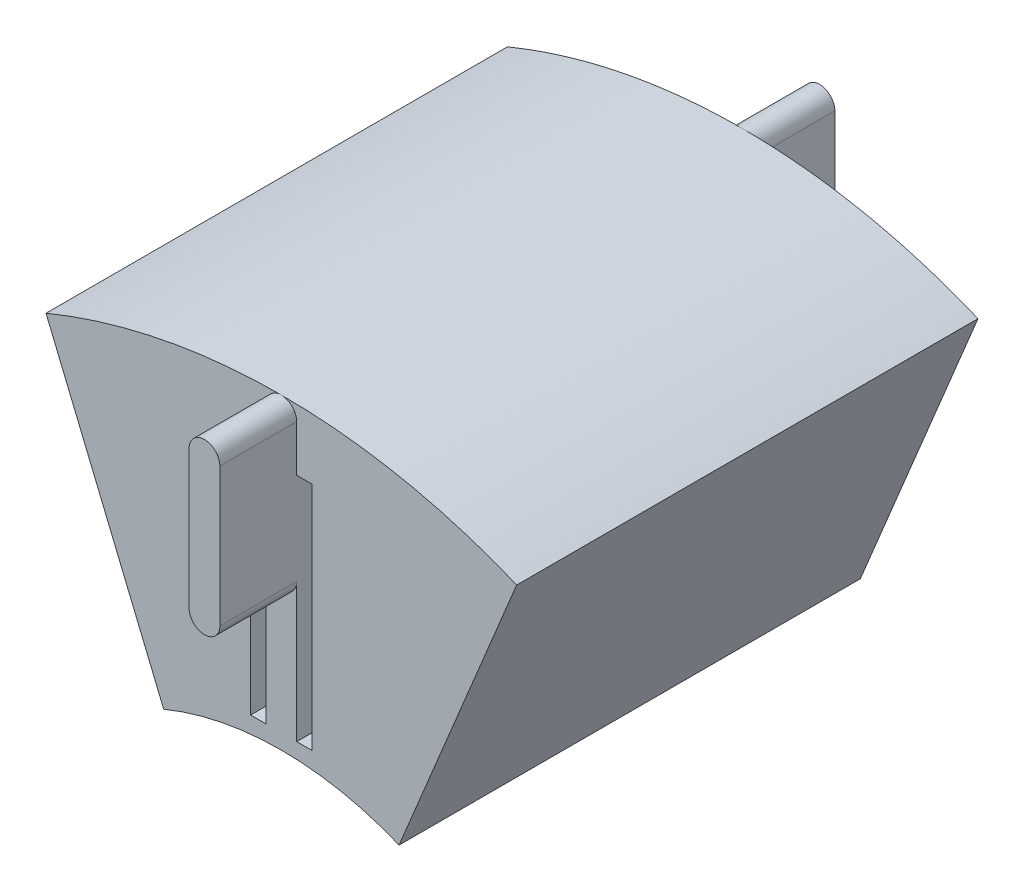
ISO-10303-21;
HEADER;
FILE_DESCRIPTION(('STEP AP214'),'2;1');
FILE_NAME('part.step','',(''),(''),'','','');
FILE_SCHEMA(('AUTOMOTIVE_DESIGN { 1 0 10303 214 1 1 1 1 }'));
ENDSEC;
DATA;
#1=APPLICATION_CONTEXT('core data for automotive mechanical design processes');
#2=APPLICATION_PROTOCOL_DEFINITION('international standard','automotive_design',2000,#1);
#3=PRODUCT_CONTEXT('',#1,'mechanical');
#4=PRODUCT('Part','Part','',(#3));
#5=PRODUCT_RELATED_PRODUCT_CATEGORY('part','',(#4));
#6=PRODUCT_DEFINITION_FORMATION('','',#4);
#7=PRODUCT_DEFINITION_CONTEXT('part definition',#1,'design');
#8=PRODUCT_DEFINITION('design','',#6,#7);
#9=PRODUCT_DEFINITION_SHAPE('','',#8);
#10=(LENGTH_UNIT() NAMED_UNIT(*) SI_UNIT(.MILLI.,.METRE.));
#11=(NAMED_UNIT(*) PLANE_ANGLE_UNIT() SI_UNIT($,.RADIAN.));
#12=(NAMED_UNIT(*) SI_UNIT($,.STERADIAN.) SOLID_ANGLE_UNIT());
#13=UNCERTAINTY_MEASURE_WITH_UNIT(LENGTH_MEASURE(1.E-05),#10,'distance_accuracy_value','');
#14=(GEOMETRIC_REPRESENTATION_CONTEXT(3) GLOBAL_UNCERTAINTY_ASSIGNED_CONTEXT((#13)) GLOBAL_UNIT_ASSIGNED_CONTEXT((#10,
#11,#12)) REPRESENTATION_CONTEXT('',''));
#15=CARTESIAN_POINT('',(0.,0.,0.));
#16=DIRECTION('',(0.,0.,1.));
#17=DIRECTION('',(1.,0.,0.));
#18=AXIS2_PLACEMENT_3D('',#15,#16,#17);
#19=CARTESIAN_POINT('',(0.2,3.59775906502258,3.));
#20=DIRECTION('',(0.,-0.8,0.6));
#21=DIRECTION('',(0.,-0.6,-0.8));
#22=AXIS2_PLACEMENT_3D('',#19,#20,#21);
#23=PLANE('',#22);
#24=DIRECTION('',(0.,-0.6,-0.8));
#25=VECTOR('',#24,1.);
#26=CARTESIAN_POINT('',(-0.1,3.59775906502258,3.));
#27=LINE('',#26,#25);
#28=CARTESIAN_POINT('',(-0.1,3.59775906502258,3.));
#29=VERTEX_POINT('',#28);
#30=CARTESIAN_POINT('',(-0.0999999999999998,2.09775906502258,1.));
#31=VERTEX_POINT('',#30);
#32=EDGE_CURVE('E409',#29,#31,#27,.T.);
#33=ORIENTED_EDGE('',*,*,#32,.F.);
#34=DIRECTION('',(-1.,0.,0.));
#35=VECTOR('',#34,1.);
#36=CARTESIAN_POINT('',(0.2,3.59775906502258,3.));
#37=LINE('',#36,#35);
#38=CARTESIAN_POINT('',(-0.2,3.59775906502258,3.));
#39=VERTEX_POINT('',#38);
#40=EDGE_CURVE('E197',#29,#39,#37,.T.);
#41=ORIENTED_EDGE('',*,*,#40,.T.);
#42=DIRECTION('',(0.,0.6,0.8));
#43=VECTOR('',#42,1.);
#44=CARTESIAN_POINT('',(-0.2,3.59775906502258,3.));
#45=LINE('',#44,#43);
#46=CARTESIAN_POINT('',(-0.2,2.09775906502258,1.));
#47=VERTEX_POINT('',#46);
#48=EDGE_CURVE('E412',#47,#39,#45,.T.);
#49=ORIENTED_EDGE('',*,*,#48,.F.);
#50=DIRECTION('',(-1.,0.,0.));
#51=VECTOR('',#50,1.);
#52=CARTESIAN_POINT('',(0.2,2.09775906502258,1.));
#53=LINE('',#52,#51);
#54=EDGE_CURVE('E433',#31,#47,#53,.T.);
#55=ORIENTED_EDGE('',*,*,#54,.F.);
#56=EDGE_LOOP('',(#33,#41,#49,#55));
#57=FACE_BOUND('',#56,.T.);
#58=ADVANCED_FACE('F41',(#57),#23,.T.);
#59=CARTESIAN_POINT('',(0.2,2.09775906502258,3.));
#60=DIRECTION('',(0.,1.,0.));
#61=DIRECTION('',(0.,0.,1.));
#62=AXIS2_PLACEMENT_3D('',#59,#60,#61);
#63=PLANE('',#62);
#64=DIRECTION('',(0.,0.,1.));
#65=VECTOR('',#64,1.);
#66=CARTESIAN_POINT('',(-0.0999999999999999,2.09775906502258,3.));
#67=LINE('',#66,#65);
#68=CARTESIAN_POINT('',(-0.1,2.09775906502258,3.));
#69=VERTEX_POINT('',#68);
#70=EDGE_CURVE('E11',#31,#69,#67,.T.);
#71=ORIENTED_EDGE('',*,*,#70,.F.);
#72=ORIENTED_EDGE('',*,*,#54,.T.);
#73=DIRECTION('',(0.,0.,-1.));
#74=VECTOR('',#73,1.);
#75=CARTESIAN_POINT('',(-0.2,2.09775906502258,3.));
#76=LINE('',#75,#74);
#77=CARTESIAN_POINT('',(-0.2,2.09775906502258,3.));
#78=VERTEX_POINT('',#77);
#79=EDGE_CURVE('E423',#78,#47,#76,.T.);
#80=ORIENTED_EDGE('',*,*,#79,.F.);
#81=DIRECTION('',(-1.,0.,0.));
#82=VECTOR('',#81,1.);
#83=CARTESIAN_POINT('',(0.2,2.09775906502258,3.));
#84=LINE('',#83,#82);
#85=EDGE_CURVE('E198',#69,#78,#84,.T.);
#86=ORIENTED_EDGE('',*,*,#85,.F.);
#87=EDGE_LOOP('',(#71,#72,#80,#86));
#88=FACE_BOUND('',#87,.T.);
#89=ADVANCED_FACE('F389',(#88),#63,.T.);
#90=CARTESIAN_POINT('',(0.,0.,3.));
#91=DIRECTION('',(0.,0.,1.));
#92=DIRECTION('',(1.,0.,0.));
#93=AXIS2_PLACEMENT_3D('',#90,#91,#92);
#94=PLANE('',#93);
#95=DIRECTION('',(0.,1.,0.));
#96=VECTOR('',#95,1.);
#97=CARTESIAN_POINT('',(0.1,3.,3.));
#98=LINE('',#97,#96);
#99=CARTESIAN_POINT('',(0.1,3.59775906502258,3.));
#100=VERTEX_POINT('',#99);
#101=CARTESIAN_POINT('',(0.1,3.9,3.));
#102=VERTEX_POINT('',#101);
#103=EDGE_CURVE('E269',#100,#102,#98,.T.);
#104=ORIENTED_EDGE('',*,*,#103,.F.);
#105=CARTESIAN_POINT('',(0.2,3.59775906502258,3.));
#106=VERTEX_POINT('',#105);
#107=EDGE_CURVE('E202',#106,#100,#37,.T.);
#108=ORIENTED_EDGE('',*,*,#107,.F.);
#109=DIRECTION('',(0.,-1.,0.));
#110=VECTOR('',#109,1.);
#111=CARTESIAN_POINT('',(0.2,3.59775906502258,3.));
#112=LINE('',#111,#110);
#113=CARTESIAN_POINT('',(0.2,2.09775906502258,3.));
#114=VERTEX_POINT('',#113);
#115=EDGE_CURVE('E195',#106,#114,#112,.T.);
#116=ORIENTED_EDGE('',*,*,#115,.T.);
#117=CARTESIAN_POINT('',(0.1,2.09775906502258,3.));
#118=VERTEX_POINT('',#117);
#119=EDGE_CURVE('E185',#114,#118,#84,.T.);
#120=ORIENTED_EDGE('',*,*,#119,.T.);
#121=DIRECTION('',(0.,1.,0.));
#122=VECTOR('',#121,1.);
#123=CARTESIAN_POINT('',(0.1,3.59775906502258,3.));
#124=LINE('',#123,#122);
#125=CARTESIAN_POINT('',(0.1,3.,3.));
#126=VERTEX_POINT('',#125);
#127=EDGE_CURVE('E171',#118,#126,#124,.T.);
#128=ORIENTED_EDGE('',*,*,#127,.T.);
#129=CARTESIAN_POINT('',(0.,3.,3.));
#130=DIRECTION('',(0.,0.,1.));
#131=DIRECTION('',(1.,0.,0.));
#132=AXIS2_PLACEMENT_3D('',#129,#130,#131);
#133=CIRCLE('',#132,0.1);
#134=CARTESIAN_POINT('',(-0.0999999999999999,3.,3.));
#135=VERTEX_POINT('',#134);
#136=EDGE_CURVE('E251',#135,#126,#133,.T.);
#137=ORIENTED_EDGE('',*,*,#136,.F.);
#138=DIRECTION('',(0.,-1.,0.));
#139=VECTOR('',#138,1.);
#140=CARTESIAN_POINT('',(-0.1,3.59775906502258,3.));
#141=LINE('',#140,#139);
#142=EDGE_CURVE('E57',#135,#69,#141,.T.);
#143=ORIENTED_EDGE('',*,*,#142,.T.);
#144=ORIENTED_EDGE('',*,*,#85,.T.);
#145=DIRECTION('',(0.,-1.,0.));
#146=VECTOR('',#145,1.);
#147=CARTESIAN_POINT('',(-0.2,3.59775906502258,3.));
#148=LINE('',#147,#146);
#149=EDGE_CURVE('E419',#39,#78,#148,.T.);
#150=ORIENTED_EDGE('',*,*,#149,.F.);
#151=ORIENTED_EDGE('',*,*,#40,.F.);
#152=DIRECTION('',(0.,-1.,0.));
#153=VECTOR('',#152,1.);
#154=CARTESIAN_POINT('',(-0.1,3.,3.));
#155=LINE('',#154,#153);
#156=CARTESIAN_POINT('',(-0.1,3.9,3.));
#157=VERTEX_POINT('',#156);
#158=EDGE_CURVE('E257',#157,#29,#155,.T.);
#159=ORIENTED_EDGE('',*,*,#158,.F.);
#160=CARTESIAN_POINT('',(0.,3.9,3.));
#161=DIRECTION('',(0.,0.,1.));
#162=DIRECTION('',(1.,0.,0.));
#163=AXIS2_PLACEMENT_3D('',#160,#161,#162);
#164=CIRCLE('',#163,0.1);
#165=CARTESIAN_POINT('',(0.,4.,3.));
#166=VERTEX_POINT('',#165);
#167=EDGE_CURVE('E276',#166,#157,#164,.T.);
#168=ORIENTED_EDGE('',*,*,#167,.F.);
#169=CARTESIAN_POINT('',(0.,0.,3.));
#170=DIRECTION('',(0.,0.,1.));
#171=DIRECTION('',(1.,0.,0.));
#172=AXIS2_PLACEMENT_3D('',#169,#170,#171);
#173=CIRCLE('',#172,4.);
#174=CARTESIAN_POINT('',(-1.53073372946035,3.69551813004515,3.));
#175=VERTEX_POINT('',#174);
#176=EDGE_CURVE('E307',#175,#166,#173,.F.);
#177=ORIENTED_EDGE('',*,*,#176,.F.);
#178=DIRECTION('',(0.382683432365087,-0.923879532511288,0.));
#179=VECTOR('',#178,1.);
#180=CARTESIAN_POINT('',(0.,0.,3.));
#181=LINE('',#180,#179);
#182=CARTESIAN_POINT('',(-0.765366864730173,1.84775906502258,3.));
#183=VERTEX_POINT('',#182);
#184=EDGE_CURVE('E294',#175,#183,#181,.T.);
#185=ORIENTED_EDGE('',*,*,#184,.T.);
#186=CARTESIAN_POINT('',(0.,0.,3.));
#187=DIRECTION('',(0.,0.,1.));
#188=DIRECTION('',(1.,0.,0.));
#189=AXIS2_PLACEMENT_3D('',#186,#187,#188);
#190=CIRCLE('',#189,2.);
#191=CARTESIAN_POINT('',(0.765366864730173,1.84775906502258,3.));
#192=VERTEX_POINT('',#191);
#193=EDGE_CURVE('E298',#183,#192,#190,.F.);
#194=ORIENTED_EDGE('',*,*,#193,.T.);
#195=DIRECTION('',(0.382683432365087,0.923879532511288,0.));
#196=VECTOR('',#195,1.);
#197=CARTESIAN_POINT('',(0.,0.,3.));
#198=LINE('',#197,#196);
#199=CARTESIAN_POINT('',(1.53073372946035,3.69551813004515,3.));
#200=VERTEX_POINT('',#199);
#201=EDGE_CURVE('E302',#192,#200,#198,.T.);
#202=ORIENTED_EDGE('',*,*,#201,.T.);
#203=EDGE_CURVE('E306',#166,#200,#173,.F.);
#204=ORIENTED_EDGE('',*,*,#203,.F.);
#205=EDGE_CURVE('E272',#102,#166,#164,.T.);
#206=ORIENTED_EDGE('',*,*,#205,.F.);
#207=EDGE_LOOP('',(#104,#108,#116,#120,#128,#137,#143,#144,#150,#151,#159,#168,#177,#185,#194,
#202,#204,#206));
#208=FACE_BOUND('',#207,.T.);
#209=ADVANCED_FACE('F193',(#208),#94,.T.);
#210=CARTESIAN_POINT('',(0.,0.,0.));
#211=DIRECTION('',(0.,0.,1.));
#212=DIRECTION('',(1.,0.,0.));
#213=AXIS2_PLACEMENT_3D('',#210,#211,#212);
#214=PLANE('',#213);
#215=CARTESIAN_POINT('',(0.,3.,0.));
#216=DIRECTION('',(0.,0.,-1.));
#217=DIRECTION('',(-1.,0.,0.));
#218=AXIS2_PLACEMENT_3D('',#215,#216,#217);
#219=CIRCLE('',#218,0.1);
#220=CARTESIAN_POINT('',(0.1,3.,0.));
#221=VERTEX_POINT('',#220);
#222=CARTESIAN_POINT('',(-0.1,3.,0.));
#223=VERTEX_POINT('',#222);
#224=EDGE_CURVE('E209',#221,#223,#219,.T.);
#225=ORIENTED_EDGE('',*,*,#224,.F.);
#226=DIRECTION('',(0.,-1.,0.));
#227=VECTOR('',#226,1.);
#228=CARTESIAN_POINT('',(0.1,3.,0.));
#229=LINE('',#228,#227);
#230=CARTESIAN_POINT('',(0.1,3.9,0.));
#231=VERTEX_POINT('',#230);
#232=EDGE_CURVE('E64',#231,#221,#229,.T.);
#233=ORIENTED_EDGE('',*,*,#232,.F.);
#234=CARTESIAN_POINT('',(0.,3.9,0.));
#235=DIRECTION('',(0.,0.,-1.));
#236=DIRECTION('',(-1.,0.,0.));
#237=AXIS2_PLACEMENT_3D('',#234,#235,#236);
#238=CIRCLE('',#237,0.1);
#239=CARTESIAN_POINT('',(0.,4.,0.));
#240=VERTEX_POINT('',#239);
#241=EDGE_CURVE('E190',#240,#231,#238,.T.);
#242=ORIENTED_EDGE('',*,*,#241,.F.);
#243=CARTESIAN_POINT('',(0.,0.,0.));
#244=DIRECTION('',(0.,0.,1.));
#245=DIRECTION('',(1.,0.,0.));
#246=AXIS2_PLACEMENT_3D('',#243,#244,#245);
#247=CIRCLE('',#246,4.);
#248=CARTESIAN_POINT('',(1.53073372946035,3.69551813004515,0.));
#249=VERTEX_POINT('',#248);
#250=EDGE_CURVE('E322',#240,#249,#247,.F.);
#251=ORIENTED_EDGE('',*,*,#250,.T.);
#252=DIRECTION('',(0.382683432365087,0.923879532511288,0.));
#253=VECTOR('',#252,1.);
#254=CARTESIAN_POINT('',(0.,0.,0.));
#255=LINE('',#254,#253);
#256=CARTESIAN_POINT('',(0.765366864730173,1.84775906502258,0.));
#257=VERTEX_POINT('',#256);
#258=EDGE_CURVE('E318',#257,#249,#255,.T.);
#259=ORIENTED_EDGE('',*,*,#258,.F.);
#260=CARTESIAN_POINT('',(0.,0.,0.));
#261=DIRECTION('',(0.,0.,1.));
#262=DIRECTION('',(1.,0.,0.));
#263=AXIS2_PLACEMENT_3D('',#260,#261,#262);
#264=CIRCLE('',#263,2.);
#265=CARTESIAN_POINT('',(-0.765366864730173,1.84775906502258,0.));
#266=VERTEX_POINT('',#265);
#267=EDGE_CURVE('E315',#266,#257,#264,.F.);
#268=ORIENTED_EDGE('',*,*,#267,.F.);
#269=DIRECTION('',(0.382683432365087,-0.923879532511288,0.));
#270=VECTOR('',#269,1.);
#271=CARTESIAN_POINT('',(0.,0.,0.));
#272=LINE('',#271,#270);
#273=CARTESIAN_POINT('',(-1.53073372946035,3.69551813004515,0.));
#274=VERTEX_POINT('',#273);
#275=EDGE_CURVE('E293',#274,#266,#272,.T.);
#276=ORIENTED_EDGE('',*,*,#275,.F.);
#277=EDGE_CURVE('E299',#274,#240,#247,.F.);
#278=ORIENTED_EDGE('',*,*,#277,.T.);
#279=CARTESIAN_POINT('',(-0.1,3.9,0.));
#280=VERTEX_POINT('',#279);
#281=EDGE_CURVE('E230',#280,#240,#238,.T.);
#282=ORIENTED_EDGE('',*,*,#281,.F.);
#283=DIRECTION('',(0.,1.,0.));
#284=VECTOR('',#283,1.);
#285=CARTESIAN_POINT('',(-0.1,3.,0.));
#286=LINE('',#285,#284);
#287=EDGE_CURVE('E227',#223,#280,#286,.T.);
#288=ORIENTED_EDGE('',*,*,#287,.F.);
#289=EDGE_LOOP('',(#225,#233,#242,#251,#259,#268,#276,#278,#282,#288));
#290=FACE_BOUND('',#289,.T.);
#291=ADVANCED_FACE('F363',(#290),#214,.F.);
#292=CARTESIAN_POINT('',(0.,0.,3.));
#293=DIRECTION('',(0.923879532511288,0.382683432365087,0.));
#294=DIRECTION('',(-0.382683432365087,0.923879532511288,0.));
#295=AXIS2_PLACEMENT_3D('',#292,#293,#294);
#296=PLANE('',#295);
#297=ORIENTED_EDGE('',*,*,#275,.T.);
#298=DIRECTION('',(0.,0.,-1.));
#299=VECTOR('',#298,1.);
#300=CARTESIAN_POINT('',(-0.765366864730173,1.84775906502258,3.));
#301=LINE('',#300,#299);
#302=EDGE_CURVE('E336',#183,#266,#301,.T.);
#303=ORIENTED_EDGE('',*,*,#302,.F.);
#304=ORIENTED_EDGE('',*,*,#184,.F.);
#305=DIRECTION('',(0.,0.,-1.));
#306=VECTOR('',#305,1.);
#307=CARTESIAN_POINT('',(-1.53073372946035,3.69551813004515,3.));
#308=LINE('',#307,#306);
#309=EDGE_CURVE('E311',#175,#274,#308,.T.);
#310=ORIENTED_EDGE('',*,*,#309,.T.);
#311=EDGE_LOOP('',(#297,#303,#304,#310));
#312=FACE_BOUND('',#311,.T.);
#313=ADVANCED_FACE('F43',(#312),#296,.F.);
#314=CARTESIAN_POINT('',(0.,0.,3.));
#315=DIRECTION('',(0.,0.,-1.));
#316=DIRECTION('',(-1.,0.,0.));
#317=AXIS2_PLACEMENT_3D('',#314,#315,#316);
#318=CYLINDRICAL_SURFACE('',#317,2.);
#319=ORIENTED_EDGE('',*,*,#267,.T.);
#320=DIRECTION('',(0.,0.,-1.));
#321=VECTOR('',#320,1.);
#322=CARTESIAN_POINT('',(0.765366864730173,1.84775906502258,3.));
#323=LINE('',#322,#321);
#324=EDGE_CURVE('E332',#192,#257,#323,.T.);
#325=ORIENTED_EDGE('',*,*,#324,.F.);
#326=ORIENTED_EDGE('',*,*,#193,.F.);
#327=ORIENTED_EDGE('',*,*,#302,.T.);
#328=EDGE_LOOP('',(#319,#325,#326,#327));
#329=FACE_BOUND('',#328,.T.);
#330=ADVANCED_FACE('F380',(#329),#318,.F.);
#331=CARTESIAN_POINT('',(0.,0.,3.));
#332=DIRECTION('',(-0.923879532511288,0.382683432365087,0.));
#333=DIRECTION('',(-0.382683432365087,-0.923879532511288,0.));
#334=AXIS2_PLACEMENT_3D('',#331,#332,#333);
#335=PLANE('',#334);
#336=ORIENTED_EDGE('',*,*,#258,.T.);
#337=DIRECTION('',(0.,0.,-1.));
#338=VECTOR('',#337,1.);
#339=CARTESIAN_POINT('',(1.53073372946035,3.69551813004515,3.));
#340=LINE('',#339,#338);
#341=EDGE_CURVE('E328',#200,#249,#340,.T.);
#342=ORIENTED_EDGE('',*,*,#341,.F.);
#343=ORIENTED_EDGE('',*,*,#201,.F.);
#344=ORIENTED_EDGE('',*,*,#324,.T.);
#345=EDGE_LOOP('',(#336,#342,#343,#344));
#346=FACE_BOUND('',#345,.T.);
#347=ADVANCED_FACE('F379',(#346),#335,.F.);
#348=CARTESIAN_POINT('',(0.,0.,3.));
#349=DIRECTION('',(0.,0.,-1.));
#350=DIRECTION('',(-1.,0.,0.));
#351=AXIS2_PLACEMENT_3D('',#348,#349,#350);
#352=CYLINDRICAL_SURFACE('',#351,4.);
#353=ORIENTED_EDGE('',*,*,#277,.F.);
#354=ORIENTED_EDGE('',*,*,#309,.F.);
#355=ORIENTED_EDGE('',*,*,#176,.T.);
#356=ORIENTED_EDGE('',*,*,#203,.T.);
#357=ORIENTED_EDGE('',*,*,#341,.T.);
#358=ORIENTED_EDGE('',*,*,#250,.F.);
#359=EDGE_LOOP('',(#353,#354,#355,#356,#357,#358));
#360=FACE_BOUND('',#359,.T.);
#361=ADVANCED_FACE('F367',(#360),#352,.T.);
#362=CARTESIAN_POINT('',(0.,3.,3.5));
#363=DIRECTION('',(0.,0.,-1.));
#364=DIRECTION('',(-1.,0.,0.));
#365=AXIS2_PLACEMENT_3D('',#362,#363,#364);
#366=CYLINDRICAL_SURFACE('',#365,0.1);
#367=ORIENTED_EDGE('',*,*,#136,.T.);
#368=DIRECTION('',(0.,0.,-1.));
#369=VECTOR('',#368,1.);
#370=CARTESIAN_POINT('',(0.1,3.,3.5));
#371=LINE('',#370,#369);
#372=CARTESIAN_POINT('',(0.1,3.,3.5));
#373=VERTEX_POINT('',#372);
#374=EDGE_CURVE('E176',#373,#126,#371,.T.);
#375=ORIENTED_EDGE('',*,*,#374,.F.);
#376=CARTESIAN_POINT('',(0.,3.,3.5));
#377=DIRECTION('',(0.,0.,1.));
#378=DIRECTION('',(1.,0.,0.));
#379=AXIS2_PLACEMENT_3D('',#376,#377,#378);
#380=CIRCLE('',#379,0.1);
#381=CARTESIAN_POINT('',(-0.1,3.,3.5));
#382=VERTEX_POINT('',#381);
#383=EDGE_CURVE('E252',#382,#373,#380,.T.);
#384=ORIENTED_EDGE('',*,*,#383,.F.);
#385=DIRECTION('',(0.,0.,-1.));
#386=VECTOR('',#385,1.);
#387=CARTESIAN_POINT('',(-0.1,3.,3.5));
#388=LINE('',#387,#386);
#389=EDGE_CURVE('E266',#382,#135,#388,.T.);
#390=ORIENTED_EDGE('',*,*,#389,.T.);
#391=EDGE_LOOP('',(#367,#375,#384,#390));
#392=FACE_BOUND('',#391,.T.);
#393=ADVANCED_FACE('F456',(#392),#366,.T.);
#394=CARTESIAN_POINT('',(0.1,3.,3.5));
#395=DIRECTION('',(-1.,0.,0.));
#396=DIRECTION('',(0.,0.,1.));
#397=AXIS2_PLACEMENT_3D('',#394,#395,#396);
#398=PLANE('',#397);
#399=ORIENTED_EDGE('',*,*,#374,.T.);
#400=ORIENTED_EDGE('',*,*,#127,.F.);
#401=DIRECTION('',(0.,0.,-1.));
#402=VECTOR('',#401,1.);
#403=CARTESIAN_POINT('',(0.1,2.09775906502258,3.));
#404=LINE('',#403,#402);
#405=CARTESIAN_POINT('',(0.1,2.09775906502258,1.));
#406=VERTEX_POINT('',#405);
#407=EDGE_CURVE('E50',#118,#406,#404,.T.);
#408=ORIENTED_EDGE('',*,*,#407,.T.);
#409=DIRECTION('',(0.,0.6,0.8));
#410=VECTOR('',#409,1.);
#411=CARTESIAN_POINT('',(0.1,3.59775906502258,3.));
#412=LINE('',#411,#410);
#413=EDGE_CURVE('E180',#406,#100,#412,.T.);
#414=ORIENTED_EDGE('',*,*,#413,.T.);
#415=ORIENTED_EDGE('',*,*,#103,.T.);
#416=DIRECTION('',(0.,0.,-1.));
#417=VECTOR('',#416,1.);
#418=CARTESIAN_POINT('',(0.1,3.9,3.5));
#419=LINE('',#418,#417);
#420=CARTESIAN_POINT('',(0.1,3.9,3.5));
#421=VERTEX_POINT('',#420);
#422=EDGE_CURVE('E287',#421,#102,#419,.T.);
#423=ORIENTED_EDGE('',*,*,#422,.F.);
#424=DIRECTION('',(0.,1.,0.));
#425=VECTOR('',#424,1.);
#426=CARTESIAN_POINT('',(0.1,3.,3.5));
#427=LINE('',#426,#425);
#428=EDGE_CURVE('E256',#373,#421,#427,.T.);
#429=ORIENTED_EDGE('',*,*,#428,.F.);
#430=EDGE_LOOP('',(#399,#400,#408,#414,#415,#423,#429));
#431=FACE_BOUND('',#430,.T.);
#432=ADVANCED_FACE('F173',(#431),#398,.F.);
#433=CARTESIAN_POINT('',(0.,3.9,3.5));
#434=DIRECTION('',(0.,0.,-1.));
#435=DIRECTION('',(-1.,0.,0.));
#436=AXIS2_PLACEMENT_3D('',#433,#434,#435);
#437=CYLINDRICAL_SURFACE('',#436,0.1);
#438=ORIENTED_EDGE('',*,*,#205,.T.);
#439=ORIENTED_EDGE('',*,*,#167,.T.);
#440=DIRECTION('',(0.,0.,-1.));
#441=VECTOR('',#440,1.);
#442=CARTESIAN_POINT('',(-0.1,3.9,3.5));
#443=LINE('',#442,#441);
#444=CARTESIAN_POINT('',(-0.1,3.9,3.5));
#445=VERTEX_POINT('',#444);
#446=EDGE_CURVE('E283',#445,#157,#443,.T.);
#447=ORIENTED_EDGE('',*,*,#446,.F.);
#448=CARTESIAN_POINT('',(0.,3.9,3.5));
#449=DIRECTION('',(0.,0.,1.));
#450=DIRECTION('',(1.,0.,0.));
#451=AXIS2_PLACEMENT_3D('',#448,#449,#450);
#452=CIRCLE('',#451,0.1);
#453=EDGE_CURVE('E260',#421,#445,#452,.T.);
#454=ORIENTED_EDGE('',*,*,#453,.F.);
#455=ORIENTED_EDGE('',*,*,#422,.T.);
#456=EDGE_LOOP('',(#438,#439,#447,#454,#455));
#457=FACE_BOUND('',#456,.T.);
#458=ADVANCED_FACE('F450',(#457),#437,.T.);
#459=CARTESIAN_POINT('',(-0.1,3.,3.5));
#460=DIRECTION('',(1.,0.,0.));
#461=DIRECTION('',(0.,0.,-1.));
#462=AXIS2_PLACEMENT_3D('',#459,#460,#461);
#463=PLANE('',#462);
#464=ORIENTED_EDGE('',*,*,#158,.T.);
#465=ORIENTED_EDGE('',*,*,#32,.T.);
#466=ORIENTED_EDGE('',*,*,#70,.T.);
#467=ORIENTED_EDGE('',*,*,#142,.F.);
#468=ORIENTED_EDGE('',*,*,#389,.F.);
#469=DIRECTION('',(0.,-1.,0.));
#470=VECTOR('',#469,1.);
#471=CARTESIAN_POINT('',(-0.1,3.,3.5));
#472=LINE('',#471,#470);
#473=EDGE_CURVE('E263',#445,#382,#472,.T.);
#474=ORIENTED_EDGE('',*,*,#473,.F.);
#475=ORIENTED_EDGE('',*,*,#446,.T.);
#476=EDGE_LOOP('',(#464,#465,#466,#467,#468,#474,#475));
#477=FACE_BOUND('',#476,.T.);
#478=ADVANCED_FACE('F446',(#477),#463,.F.);
#479=CARTESIAN_POINT('',(0.,3.,3.5));
#480=DIRECTION('',(0.,0.,1.));
#481=DIRECTION('',(1.,0.,0.));
#482=AXIS2_PLACEMENT_3D('',#479,#480,#481);
#483=PLANE('',#482);
#484=ORIENTED_EDGE('',*,*,#383,.T.);
#485=ORIENTED_EDGE('',*,*,#428,.T.);
#486=ORIENTED_EDGE('',*,*,#453,.T.);
#487=ORIENTED_EDGE('',*,*,#473,.T.);
#488=EDGE_LOOP('',(#484,#485,#486,#487));
#489=FACE_BOUND('',#488,.T.);
#490=ADVANCED_FACE('F453',(#489),#483,.T.);
#491=CARTESIAN_POINT('',(0.,3.,-0.5));
#492=DIRECTION('',(0.,0.,1.));
#493=DIRECTION('',(1.,0.,0.));
#494=AXIS2_PLACEMENT_3D('',#491,#492,#493);
#495=CYLINDRICAL_SURFACE('',#494,0.1);
#496=ORIENTED_EDGE('',*,*,#224,.T.);
#497=DIRECTION('',(0.,0.,1.));
#498=VECTOR('',#497,1.);
#499=CARTESIAN_POINT('',(-0.1,3.,-0.5));
#500=LINE('',#499,#498);
#501=CARTESIAN_POINT('',(-0.1,3.,-0.5));
#502=VERTEX_POINT('',#501);
#503=EDGE_CURVE('E247',#502,#223,#500,.T.);
#504=ORIENTED_EDGE('',*,*,#503,.F.);
#505=CARTESIAN_POINT('',(0.,3.,-0.5));
#506=DIRECTION('',(0.,0.,-1.));
#507=DIRECTION('',(-1.,0.,0.));
#508=AXIS2_PLACEMENT_3D('',#505,#506,#507);
#509=CIRCLE('',#508,0.1);
#510=CARTESIAN_POINT('',(0.1,3.,-0.5));
#511=VERTEX_POINT('',#510);
#512=EDGE_CURVE('E210',#511,#502,#509,.T.);
#513=ORIENTED_EDGE('',*,*,#512,.F.);
#514=DIRECTION('',(0.,0.,1.));
#515=VECTOR('',#514,1.);
#516=CARTESIAN_POINT('',(0.1,3.,-0.5));
#517=LINE('',#516,#515);
#518=EDGE_CURVE('E223',#511,#221,#517,.T.);
#519=ORIENTED_EDGE('',*,*,#518,.T.);
#520=EDGE_LOOP('',(#496,#504,#513,#519));
#521=FACE_BOUND('',#520,.T.);
#522=ADVANCED_FACE('F490',(#521),#495,.T.);
#523=CARTESIAN_POINT('',(-0.1,3.,-0.5));
#524=DIRECTION('',(1.,0.,0.));
#525=DIRECTION('',(0.,1.,0.));
#526=AXIS2_PLACEMENT_3D('',#523,#524,#525);
#527=PLANE('',#526);
#528=ORIENTED_EDGE('',*,*,#287,.T.);
#529=DIRECTION('',(0.,0.,1.));
#530=VECTOR('',#529,1.);
#531=CARTESIAN_POINT('',(-0.1,3.9,-0.5));
#532=LINE('',#531,#530);
#533=CARTESIAN_POINT('',(-0.1,3.9,-0.5));
#534=VERTEX_POINT('',#533);
#535=EDGE_CURVE('E243',#534,#280,#532,.T.);
#536=ORIENTED_EDGE('',*,*,#535,.F.);
#537=DIRECTION('',(0.,1.,0.));
#538=VECTOR('',#537,1.);
#539=CARTESIAN_POINT('',(-0.1,3.,-0.5));
#540=LINE('',#539,#538);
#541=EDGE_CURVE('E214',#502,#534,#540,.T.);
#542=ORIENTED_EDGE('',*,*,#541,.F.);
#543=ORIENTED_EDGE('',*,*,#503,.T.);
#544=EDGE_LOOP('',(#528,#536,#542,#543));
#545=FACE_BOUND('',#544,.T.);
#546=ADVANCED_FACE('F362',(#545),#527,.F.);
#547=CARTESIAN_POINT('',(0.,3.9,-0.5));
#548=DIRECTION('',(0.,0.,1.));
#549=DIRECTION('',(1.,0.,0.));
#550=AXIS2_PLACEMENT_3D('',#547,#548,#549);
#551=CYLINDRICAL_SURFACE('',#550,0.1);
#552=ORIENTED_EDGE('',*,*,#281,.T.);
#553=ORIENTED_EDGE('',*,*,#241,.T.);
#554=DIRECTION('',(0.,0.,1.));
#555=VECTOR('',#554,1.);
#556=CARTESIAN_POINT('',(0.1,3.9,-0.5));
#557=LINE('',#556,#555);
#558=CARTESIAN_POINT('',(0.1,3.9,-0.5));
#559=VERTEX_POINT('',#558);
#560=EDGE_CURVE('E239',#559,#231,#557,.T.);
#561=ORIENTED_EDGE('',*,*,#560,.F.);
#562=CARTESIAN_POINT('',(0.,3.9,-0.5));
#563=DIRECTION('',(0.,0.,-1.));
#564=DIRECTION('',(-1.,0.,0.));
#565=AXIS2_PLACEMENT_3D('',#562,#563,#564);
#566=CIRCLE('',#565,0.1);
#567=EDGE_CURVE('E217',#534,#559,#566,.T.);
#568=ORIENTED_EDGE('',*,*,#567,.F.);
#569=ORIENTED_EDGE('',*,*,#535,.T.);
#570=EDGE_LOOP('',(#552,#553,#561,#568,#569));
#571=FACE_BOUND('',#570,.T.);
#572=ADVANCED_FACE('F348',(#571),#551,.T.);
#573=CARTESIAN_POINT('',(0.1,3.,-0.5));
#574=DIRECTION('',(-1.,0.,0.));
#575=DIRECTION('',(0.,-1.,0.));
#576=AXIS2_PLACEMENT_3D('',#573,#574,#575);
#577=PLANE('',#576);
#578=ORIENTED_EDGE('',*,*,#232,.T.);
#579=ORIENTED_EDGE('',*,*,#518,.F.);
#580=DIRECTION('',(0.,-1.,0.));
#581=VECTOR('',#580,1.);
#582=CARTESIAN_POINT('',(0.1,3.,-0.5));
#583=LINE('',#582,#581);
#584=EDGE_CURVE('E220',#559,#511,#583,.T.);
#585=ORIENTED_EDGE('',*,*,#584,.F.);
#586=ORIENTED_EDGE('',*,*,#560,.T.);
#587=EDGE_LOOP('',(#578,#579,#585,#586));
#588=FACE_BOUND('',#587,.T.);
#589=ADVANCED_FACE('F354',(#588),#577,.F.);
#590=CARTESIAN_POINT('',(0.,3.,-0.5));
#591=DIRECTION('',(0.,0.,-1.));
#592=DIRECTION('',(-1.,0.,0.));
#593=AXIS2_PLACEMENT_3D('',#590,#591,#592);
#594=PLANE('',#593);
#595=ORIENTED_EDGE('',*,*,#512,.T.);
#596=ORIENTED_EDGE('',*,*,#541,.T.);
#597=ORIENTED_EDGE('',*,*,#567,.T.);
#598=ORIENTED_EDGE('',*,*,#584,.T.);
#599=EDGE_LOOP('',(#595,#596,#597,#598));
#600=FACE_BOUND('',#599,.T.);
#601=ADVANCED_FACE('F358',(#600),#594,.T.);
#602=ORIENTED_EDGE('',*,*,#413,.F.);
#603=CARTESIAN_POINT('',(0.2,2.09775906502258,1.));
#604=VERTEX_POINT('',#603);
#605=EDGE_CURVE('E188',#604,#406,#53,.T.);
#606=ORIENTED_EDGE('',*,*,#605,.F.);
#607=DIRECTION('',(0.,0.6,0.8));
#608=VECTOR('',#607,1.);
#609=CARTESIAN_POINT('',(0.2,3.59775906502258,3.));
#610=LINE('',#609,#608);
#611=EDGE_CURVE('E427',#604,#106,#610,.T.);
#612=ORIENTED_EDGE('',*,*,#611,.T.);
#613=ORIENTED_EDGE('',*,*,#107,.T.);
#614=EDGE_LOOP('',(#602,#606,#612,#613));
#615=FACE_BOUND('',#614,.T.);
#616=ADVANCED_FACE('F392',(#615),#23,.T.);
#617=ORIENTED_EDGE('',*,*,#407,.F.);
#618=ORIENTED_EDGE('',*,*,#119,.F.);
#619=DIRECTION('',(0.,0.,-1.));
#620=VECTOR('',#619,1.);
#621=CARTESIAN_POINT('',(0.2,2.09775906502258,3.));
#622=LINE('',#621,#620);
#623=EDGE_CURVE('E431',#114,#604,#622,.T.);
#624=ORIENTED_EDGE('',*,*,#623,.T.);
#625=ORIENTED_EDGE('',*,*,#605,.T.);
#626=EDGE_LOOP('',(#617,#618,#624,#625));
#627=FACE_BOUND('',#626,.T.);
#628=ADVANCED_FACE('F184',(#627),#63,.T.);
#629=CARTESIAN_POINT('',(0.2,0.,0.));
#630=DIRECTION('',(-1.,0.,0.));
#631=DIRECTION('',(0.,0.,1.));
#632=AXIS2_PLACEMENT_3D('',#629,#630,#631);
#633=PLANE('',#632);
#634=ORIENTED_EDGE('',*,*,#611,.F.);
#635=ORIENTED_EDGE('',*,*,#623,.F.);
#636=ORIENTED_EDGE('',*,*,#115,.F.);
#637=EDGE_LOOP('',(#634,#635,#636));
#638=FACE_BOUND('',#637,.T.);
#639=ADVANCED_FACE('F405',(#638),#633,.T.);
#640=CARTESIAN_POINT('',(-0.2,0.,0.));
#641=DIRECTION('',(-1.,0.,0.));
#642=DIRECTION('',(0.,0.,1.));
#643=AXIS2_PLACEMENT_3D('',#640,#641,#642);
#644=PLANE('',#643);
#645=ORIENTED_EDGE('',*,*,#48,.T.);
#646=ORIENTED_EDGE('',*,*,#149,.T.);
#647=ORIENTED_EDGE('',*,*,#79,.T.);
#648=EDGE_LOOP('',(#645,#646,#647));
#649=FACE_BOUND('',#648,.T.);
#650=ADVANCED_FACE('F444',(#649),#644,.F.);
#651=CLOSED_SHELL('',(#58,#89,#209,#291,#313,#330,#347,#361,#393,#432,#458,#478,#490,#522,#546,
#572,#589,#601,#616,#628,#639,#650));
#652=MANIFOLD_SOLID_BREP('B2',#651);
#653=ADVANCED_BREP_SHAPE_REPRESENTATION('',(#18,#652),#14);
#654=SHAPE_DEFINITION_REPRESENTATION(#9,#653);
ENDSEC;
END-ISO-10303-21;
